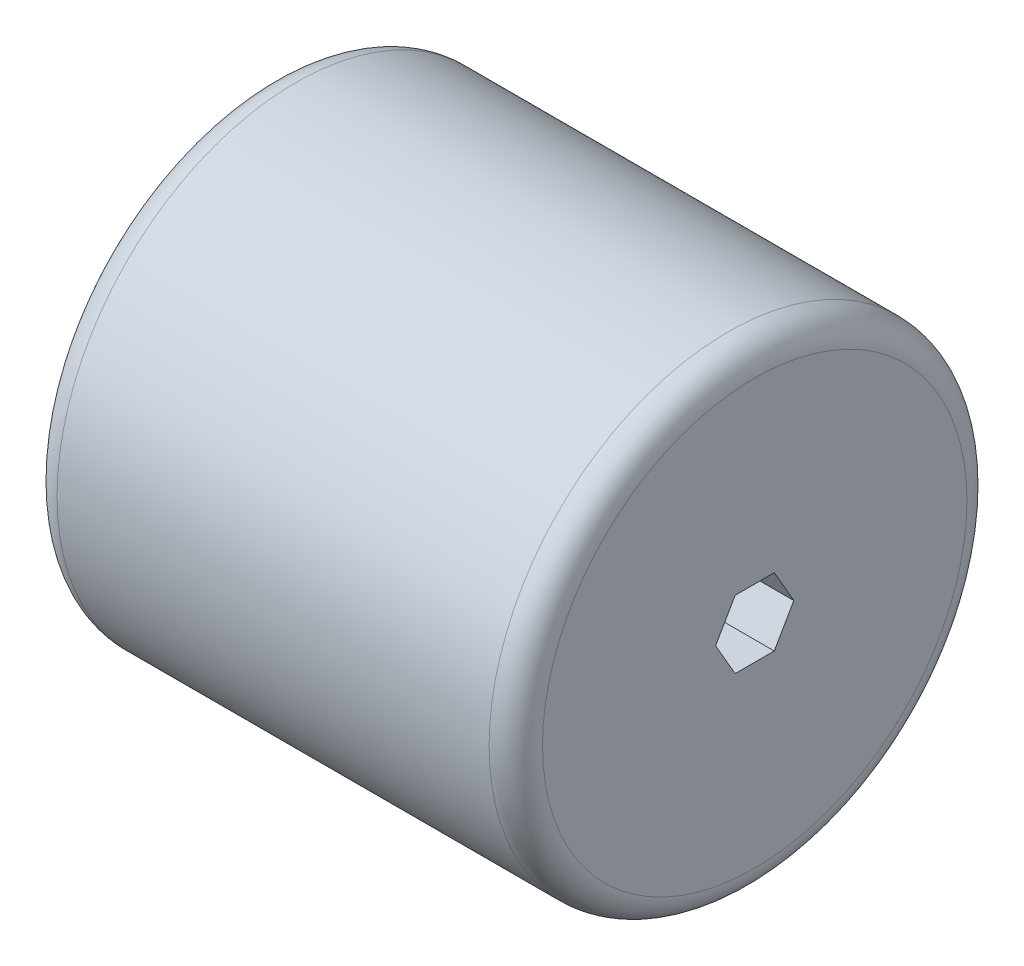
ISO-10303-21;
HEADER;
FILE_DESCRIPTION(('STEP AP214'),'2;1');
FILE_NAME('part.step','',(''),(''),'','','');
FILE_SCHEMA(('AUTOMOTIVE_DESIGN { 1 0 10303 214 1 1 1 1 }'));
ENDSEC;
DATA;
#1=APPLICATION_CONTEXT('core data for automotive mechanical design processes');
#2=APPLICATION_PROTOCOL_DEFINITION('international standard','automotive_design',2000,#1);
#3=PRODUCT_CONTEXT('',#1,'mechanical');
#4=PRODUCT('Part','Part','',(#3));
#5=PRODUCT_RELATED_PRODUCT_CATEGORY('part','',(#4));
#6=PRODUCT_DEFINITION_FORMATION('','',#4);
#7=PRODUCT_DEFINITION_CONTEXT('part definition',#1,'design');
#8=PRODUCT_DEFINITION('design','',#6,#7);
#9=PRODUCT_DEFINITION_SHAPE('','',#8);
#10=(LENGTH_UNIT() NAMED_UNIT(*) SI_UNIT(.MILLI.,.METRE.));
#11=(NAMED_UNIT(*) PLANE_ANGLE_UNIT() SI_UNIT($,.RADIAN.));
#12=(NAMED_UNIT(*) SI_UNIT($,.STERADIAN.) SOLID_ANGLE_UNIT());
#13=UNCERTAINTY_MEASURE_WITH_UNIT(LENGTH_MEASURE(1.E-05),#10,'distance_accuracy_value','');
#14=(GEOMETRIC_REPRESENTATION_CONTEXT(3) GLOBAL_UNCERTAINTY_ASSIGNED_CONTEXT((#13)) GLOBAL_UNIT_ASSIGNED_CONTEXT((#10,
#11,#12)) REPRESENTATION_CONTEXT('',''));
#15=CARTESIAN_POINT('',(0.,0.,0.));
#16=DIRECTION('',(0.,0.,1.));
#17=DIRECTION('',(1.,0.,0.));
#18=AXIS2_PLACEMENT_3D('',#15,#16,#17);
#19=CARTESIAN_POINT('',(90.96,0.,0.));
#20=DIRECTION('',(1.,0.,0.));
#21=DIRECTION('',(0.,0.,-1.));
#22=AXIS2_PLACEMENT_3D('',#19,#20,#21);
#23=PLANE('',#22);
#24=CARTESIAN_POINT('',(90.96,0.,0.));
#25=DIRECTION('',(1.,0.,0.));
#26=DIRECTION('',(0.,0.,-1.));
#27=AXIS2_PLACEMENT_3D('',#24,#25,#26);
#28=CIRCLE('',#27,39.77);
#29=CARTESIAN_POINT('',(90.96,0.,-39.77));
#30=VERTEX_POINT('',#29);
#31=EDGE_CURVE('E11',#30,#30,#28,.T.);
#32=ORIENTED_EDGE('',*,*,#31,.T.);
#33=EDGE_LOOP('',(#32));
#34=FACE_BOUND('',#33,.T.);
#35=DIRECTION('',(0.,0.866025403784438,0.500000000000001));
#36=VECTOR('',#35,1.);
#37=CARTESIAN_POINT('',(90.96,0.,-7.33234841870825));
#38=LINE('',#37,#36);
#39=CARTESIAN_POINT('',(90.96,0.,-7.33234841870825));
#40=VERTEX_POINT('',#39);
#41=CARTESIAN_POINT('',(90.96,6.35000000000001,-3.66617420935411));
#42=VERTEX_POINT('',#41);
#43=EDGE_CURVE('E102',#40,#42,#38,.T.);
#44=ORIENTED_EDGE('',*,*,#43,.F.);
#45=DIRECTION('',(0.,0.866025403784441,-0.499999999999995));
#46=VECTOR('',#45,1.);
#47=CARTESIAN_POINT('',(90.96,-6.34999999999996,-3.6661742093542));
#48=LINE('',#47,#46);
#49=CARTESIAN_POINT('',(90.96,-6.34999999999996,-3.6661742093542));
#50=VERTEX_POINT('',#49);
#51=EDGE_CURVE('E94',#50,#40,#48,.T.);
#52=ORIENTED_EDGE('',*,*,#51,.F.);
#53=DIRECTION('',(0.,0.,-1.));
#54=VECTOR('',#53,1.);
#55=CARTESIAN_POINT('',(90.96,-6.35000000000004,3.66617420935407));
#56=LINE('',#55,#54);
#57=CARTESIAN_POINT('',(90.96,-6.35000000000004,3.66617420935407));
#58=VERTEX_POINT('',#57);
#59=EDGE_CURVE('E123',#58,#50,#56,.T.);
#60=ORIENTED_EDGE('',*,*,#59,.F.);
#61=DIRECTION('',(0.,-0.866025403784434,-0.500000000000007));
#62=VECTOR('',#61,1.);
#63=CARTESIAN_POINT('',(90.96,0.,7.33234841870825));
#64=LINE('',#63,#62);
#65=CARTESIAN_POINT('',(90.96,0.,7.33234841870825));
#66=VERTEX_POINT('',#65);
#67=EDGE_CURVE('E121',#66,#58,#64,.T.);
#68=ORIENTED_EDGE('',*,*,#67,.F.);
#69=DIRECTION('',(0.,-0.866025403784441,0.499999999999995));
#70=VECTOR('',#69,1.);
#71=CARTESIAN_POINT('',(90.96,6.34999999999999,3.66617420935415));
#72=LINE('',#71,#70);
#73=CARTESIAN_POINT('',(90.96,6.34999999999999,3.66617420935415));
#74=VERTEX_POINT('',#73);
#75=EDGE_CURVE('E117',#74,#66,#72,.T.);
#76=ORIENTED_EDGE('',*,*,#75,.F.);
#77=DIRECTION('',(0.,0.,1.));
#78=VECTOR('',#77,1.);
#79=CARTESIAN_POINT('',(90.96,6.35000000000001,-3.66617420935411));
#80=LINE('',#79,#78);
#81=EDGE_CURVE('E115',#42,#74,#80,.T.);
#82=ORIENTED_EDGE('',*,*,#81,.F.);
#83=EDGE_LOOP('',(#44,#52,#60,#68,#76,#82));
#84=FACE_BOUND('',#83,.T.);
#85=ADVANCED_FACE('F41',(#34,#84),#23,.T.);
#86=CARTESIAN_POINT('',(0.,0.,0.));
#87=DIRECTION('',(1.,0.,0.));
#88=DIRECTION('',(0.,0.,-1.));
#89=AXIS2_PLACEMENT_3D('',#86,#87,#88);
#90=PLANE('',#89);
#91=CARTESIAN_POINT('',(0.,0.,0.));
#92=DIRECTION('',(1.,0.,0.));
#93=DIRECTION('',(0.,0.,-1.));
#94=AXIS2_PLACEMENT_3D('',#91,#92,#93);
#95=CIRCLE('',#94,39.77);
#96=CARTESIAN_POINT('',(0.,0.,-39.77));
#97=VERTEX_POINT('',#96);
#98=EDGE_CURVE('E49',#97,#97,#95,.F.);
#99=ORIENTED_EDGE('',*,*,#98,.T.);
#100=EDGE_LOOP('',(#99));
#101=FACE_BOUND('',#100,.T.);
#102=DIRECTION('',(0.,0.866025403784441,-0.499999999999995));
#103=VECTOR('',#102,1.);
#104=CARTESIAN_POINT('',(0.,-6.34999999999996,-3.6661742093542));
#105=LINE('',#104,#103);
#106=CARTESIAN_POINT('',(0.,-6.34999999999996,-3.6661742093542));
#107=VERTEX_POINT('',#106);
#108=CARTESIAN_POINT('',(0.,0.,-7.33234841870825));
#109=VERTEX_POINT('',#108);
#110=EDGE_CURVE('E64',#107,#109,#105,.T.);
#111=ORIENTED_EDGE('',*,*,#110,.T.);
#112=DIRECTION('',(0.,0.866025403784438,0.500000000000001));
#113=VECTOR('',#112,1.);
#114=CARTESIAN_POINT('',(0.,0.,-7.33234841870825));
#115=LINE('',#114,#113);
#116=CARTESIAN_POINT('',(0.,6.35000000000001,-3.66617420935411));
#117=VERTEX_POINT('',#116);
#118=EDGE_CURVE('E109',#109,#117,#115,.T.);
#119=ORIENTED_EDGE('',*,*,#118,.T.);
#120=DIRECTION('',(0.,0.,1.));
#121=VECTOR('',#120,1.);
#122=CARTESIAN_POINT('',(0.,6.35000000000001,-3.66617420935411));
#123=LINE('',#122,#121);
#124=CARTESIAN_POINT('',(0.,6.34999999999999,3.66617420935415));
#125=VERTEX_POINT('',#124);
#126=EDGE_CURVE('E127',#117,#125,#123,.T.);
#127=ORIENTED_EDGE('',*,*,#126,.T.);
#128=DIRECTION('',(0.,-0.866025403784441,0.499999999999995));
#129=VECTOR('',#128,1.);
#130=CARTESIAN_POINT('',(0.,6.34999999999999,3.66617420935415));
#131=LINE('',#130,#129);
#132=CARTESIAN_POINT('',(0.,0.,7.33234841870825));
#133=VERTEX_POINT('',#132);
#134=EDGE_CURVE('E130',#125,#133,#131,.T.);
#135=ORIENTED_EDGE('',*,*,#134,.T.);
#136=DIRECTION('',(0.,-0.866025403784434,-0.500000000000007));
#137=VECTOR('',#136,1.);
#138=CARTESIAN_POINT('',(0.,0.,7.33234841870825));
#139=LINE('',#138,#137);
#140=CARTESIAN_POINT('',(0.,-6.35000000000004,3.66617420935407));
#141=VERTEX_POINT('',#140);
#142=EDGE_CURVE('E133',#133,#141,#139,.T.);
#143=ORIENTED_EDGE('',*,*,#142,.T.);
#144=DIRECTION('',(0.,0.,-1.));
#145=VECTOR('',#144,1.);
#146=CARTESIAN_POINT('',(0.,-6.35000000000004,3.66617420935407));
#147=LINE('',#146,#145);
#148=EDGE_CURVE('E103',#141,#107,#147,.T.);
#149=ORIENTED_EDGE('',*,*,#148,.T.);
#150=EDGE_LOOP('',(#111,#119,#127,#135,#143,#149));
#151=FACE_BOUND('',#150,.T.);
#152=ADVANCED_FACE('F152',(#101,#151),#90,.F.);
#153=CARTESIAN_POINT('',(90.96,0.,0.));
#154=DIRECTION('',(-1.,0.,0.));
#155=DIRECTION('',(0.,0.,1.));
#156=AXIS2_PLACEMENT_3D('',#153,#154,#155);
#157=CYLINDRICAL_SURFACE('',#156,44.77);
#158=CARTESIAN_POINT('',(5.,0.,0.));
#159=DIRECTION('',(1.,0.,0.));
#160=DIRECTION('',(0.,0.,-1.));
#161=AXIS2_PLACEMENT_3D('',#158,#159,#160);
#162=CIRCLE('',#161,44.77);
#163=CARTESIAN_POINT('',(5.,0.,-44.77));
#164=VERTEX_POINT('',#163);
#165=EDGE_CURVE('E147',#164,#164,#162,.T.);
#166=ORIENTED_EDGE('',*,*,#165,.T.);
#167=EDGE_LOOP('',(#166));
#168=FACE_BOUND('',#167,.T.);
#169=CARTESIAN_POINT('',(85.96,0.,0.));
#170=DIRECTION('',(1.,0.,0.));
#171=DIRECTION('',(0.,0.,-1.));
#172=AXIS2_PLACEMENT_3D('',#169,#170,#171);
#173=CIRCLE('',#172,44.77);
#174=CARTESIAN_POINT('',(85.96,0.,-44.77));
#175=VERTEX_POINT('',#174);
#176=EDGE_CURVE('E110',#175,#175,#173,.F.);
#177=ORIENTED_EDGE('',*,*,#176,.T.);
#178=EDGE_LOOP('',(#177));
#179=FACE_BOUND('',#178,.T.);
#180=ADVANCED_FACE('F161',(#168,#179),#157,.T.);
#181=CARTESIAN_POINT('',(90.96,-6.34999999999996,-3.6661742093542));
#182=DIRECTION('',(0.,0.499999999999995,0.866025403784442));
#183=DIRECTION('',(0.,-0.866025403784442,0.499999999999995));
#184=AXIS2_PLACEMENT_3D('',#181,#182,#183);
#185=PLANE('',#184);
#186=ORIENTED_EDGE('',*,*,#110,.F.);
#187=DIRECTION('',(-1.,0.,0.));
#188=VECTOR('',#187,1.);
#189=CARTESIAN_POINT('',(90.96,-6.34999999999996,-3.6661742093542));
#190=LINE('',#189,#188);
#191=EDGE_CURVE('E98',#50,#107,#190,.T.);
#192=ORIENTED_EDGE('',*,*,#191,.F.);
#193=ORIENTED_EDGE('',*,*,#51,.T.);
#194=DIRECTION('',(-1.,0.,0.));
#195=VECTOR('',#194,1.);
#196=CARTESIAN_POINT('',(90.96,0.,-7.33234841870825));
#197=LINE('',#196,#195);
#198=EDGE_CURVE('E97',#40,#109,#197,.T.);
#199=ORIENTED_EDGE('',*,*,#198,.T.);
#200=EDGE_LOOP('',(#186,#192,#193,#199));
#201=FACE_BOUND('',#200,.T.);
#202=ADVANCED_FACE('F96',(#201),#185,.T.);
#203=CARTESIAN_POINT('',(90.96,0.,-7.33234841870825));
#204=DIRECTION('',(0.,-0.500000000000001,0.866025403784438));
#205=DIRECTION('',(0.,-0.866025403784438,-0.500000000000001));
#206=AXIS2_PLACEMENT_3D('',#203,#204,#205);
#207=PLANE('',#206);
#208=ORIENTED_EDGE('',*,*,#118,.F.);
#209=ORIENTED_EDGE('',*,*,#198,.F.);
#210=ORIENTED_EDGE('',*,*,#43,.T.);
#211=DIRECTION('',(-1.,0.,0.));
#212=VECTOR('',#211,1.);
#213=CARTESIAN_POINT('',(90.96,6.35000000000001,-3.66617420935411));
#214=LINE('',#213,#212);
#215=EDGE_CURVE('E111',#42,#117,#214,.T.);
#216=ORIENTED_EDGE('',*,*,#215,.T.);
#217=EDGE_LOOP('',(#208,#209,#210,#216));
#218=FACE_BOUND('',#217,.T.);
#219=ADVANCED_FACE('F106',(#218),#207,.T.);
#220=CARTESIAN_POINT('',(90.96,6.35000000000001,-3.66617420935411));
#221=DIRECTION('',(0.,-1.,0.));
#222=DIRECTION('',(0.,0.,-1.));
#223=AXIS2_PLACEMENT_3D('',#220,#221,#222);
#224=PLANE('',#223);
#225=ORIENTED_EDGE('',*,*,#126,.F.);
#226=ORIENTED_EDGE('',*,*,#215,.F.);
#227=ORIENTED_EDGE('',*,*,#81,.T.);
#228=DIRECTION('',(-1.,0.,0.));
#229=VECTOR('',#228,1.);
#230=CARTESIAN_POINT('',(90.96,6.34999999999999,3.66617420935415));
#231=LINE('',#230,#229);
#232=EDGE_CURVE('E142',#74,#125,#231,.T.);
#233=ORIENTED_EDGE('',*,*,#232,.T.);
#234=EDGE_LOOP('',(#225,#226,#227,#233));
#235=FACE_BOUND('',#234,.T.);
#236=ADVANCED_FACE('F183',(#235),#224,.T.);
#237=CARTESIAN_POINT('',(90.96,6.34999999999999,3.66617420935415));
#238=DIRECTION('',(0.,-0.499999999999995,-0.866025403784442));
#239=DIRECTION('',(0.,0.866025403784442,-0.499999999999995));
#240=AXIS2_PLACEMENT_3D('',#237,#238,#239);
#241=PLANE('',#240);
#242=ORIENTED_EDGE('',*,*,#134,.F.);
#243=ORIENTED_EDGE('',*,*,#232,.F.);
#244=ORIENTED_EDGE('',*,*,#75,.T.);
#245=DIRECTION('',(-1.,0.,0.));
#246=VECTOR('',#245,1.);
#247=CARTESIAN_POINT('',(90.96,0.,7.33234841870825));
#248=LINE('',#247,#246);
#249=EDGE_CURVE('E140',#66,#133,#248,.T.);
#250=ORIENTED_EDGE('',*,*,#249,.T.);
#251=EDGE_LOOP('',(#242,#243,#244,#250));
#252=FACE_BOUND('',#251,.T.);
#253=ADVANCED_FACE('F186',(#252),#241,.T.);
#254=CARTESIAN_POINT('',(90.96,0.,7.33234841870825));
#255=DIRECTION('',(0.,0.500000000000007,-0.866025403784434));
#256=DIRECTION('',(0.,0.866025403784435,0.500000000000007));
#257=AXIS2_PLACEMENT_3D('',#254,#255,#256);
#258=PLANE('',#257);
#259=ORIENTED_EDGE('',*,*,#142,.F.);
#260=ORIENTED_EDGE('',*,*,#249,.F.);
#261=ORIENTED_EDGE('',*,*,#67,.T.);
#262=DIRECTION('',(-1.,0.,0.));
#263=VECTOR('',#262,1.);
#264=CARTESIAN_POINT('',(90.96,-6.35000000000004,3.66617420935407));
#265=LINE('',#264,#263);
#266=EDGE_CURVE('E56',#58,#141,#265,.T.);
#267=ORIENTED_EDGE('',*,*,#266,.T.);
#268=EDGE_LOOP('',(#259,#260,#261,#267));
#269=FACE_BOUND('',#268,.T.);
#270=ADVANCED_FACE('F190',(#269),#258,.T.);
#271=CARTESIAN_POINT('',(90.96,-6.35000000000004,3.66617420935407));
#272=DIRECTION('',(0.,1.,0.));
#273=DIRECTION('',(0.,0.,1.));
#274=AXIS2_PLACEMENT_3D('',#271,#272,#273);
#275=PLANE('',#274);
#276=ORIENTED_EDGE('',*,*,#148,.F.);
#277=ORIENTED_EDGE('',*,*,#266,.F.);
#278=ORIENTED_EDGE('',*,*,#59,.T.);
#279=ORIENTED_EDGE('',*,*,#191,.T.);
#280=EDGE_LOOP('',(#276,#277,#278,#279));
#281=FACE_BOUND('',#280,.T.);
#282=ADVANCED_FACE('F158',(#281),#275,.T.);
#283=CARTESIAN_POINT('',(5.,0.,0.));
#284=DIRECTION('',(1.,0.,0.));
#285=DIRECTION('',(0.,0.,-1.));
#286=AXIS2_PLACEMENT_3D('',#283,#284,#285);
#287=TOROIDAL_SURFACE('',#286,39.77,5.);
#288=ORIENTED_EDGE('',*,*,#98,.F.);
#289=EDGE_LOOP('',(#288));
#290=FACE_BOUND('',#289,.T.);
#291=ORIENTED_EDGE('',*,*,#165,.F.);
#292=EDGE_LOOP('',(#291));
#293=FACE_BOUND('',#292,.T.);
#294=ADVANCED_FACE('F155',(#290,#293),#287,.T.);
#295=CARTESIAN_POINT('',(85.96,0.,0.));
#296=DIRECTION('',(1.,0.,0.));
#297=DIRECTION('',(0.,0.,-1.));
#298=AXIS2_PLACEMENT_3D('',#295,#296,#297);
#299=TOROIDAL_SURFACE('',#298,39.77,5.);
#300=ORIENTED_EDGE('',*,*,#176,.F.);
#301=EDGE_LOOP('',(#300));
#302=FACE_BOUND('',#301,.T.);
#303=ORIENTED_EDGE('',*,*,#31,.F.);
#304=EDGE_LOOP('',(#303));
#305=FACE_BOUND('',#304,.T.);
#306=ADVANCED_FACE('F43',(#302,#305),#299,.T.);
#307=CLOSED_SHELL('',(#85,#152,#180,#202,#219,#236,#253,#270,#282,#294,#306));
#308=MANIFOLD_SOLID_BREP('B2',#307);
#309=ADVANCED_BREP_SHAPE_REPRESENTATION('',(#18,#308),#14);
#310=SHAPE_DEFINITION_REPRESENTATION(#9,#309);
ENDSEC;
END-ISO-10303-21;
